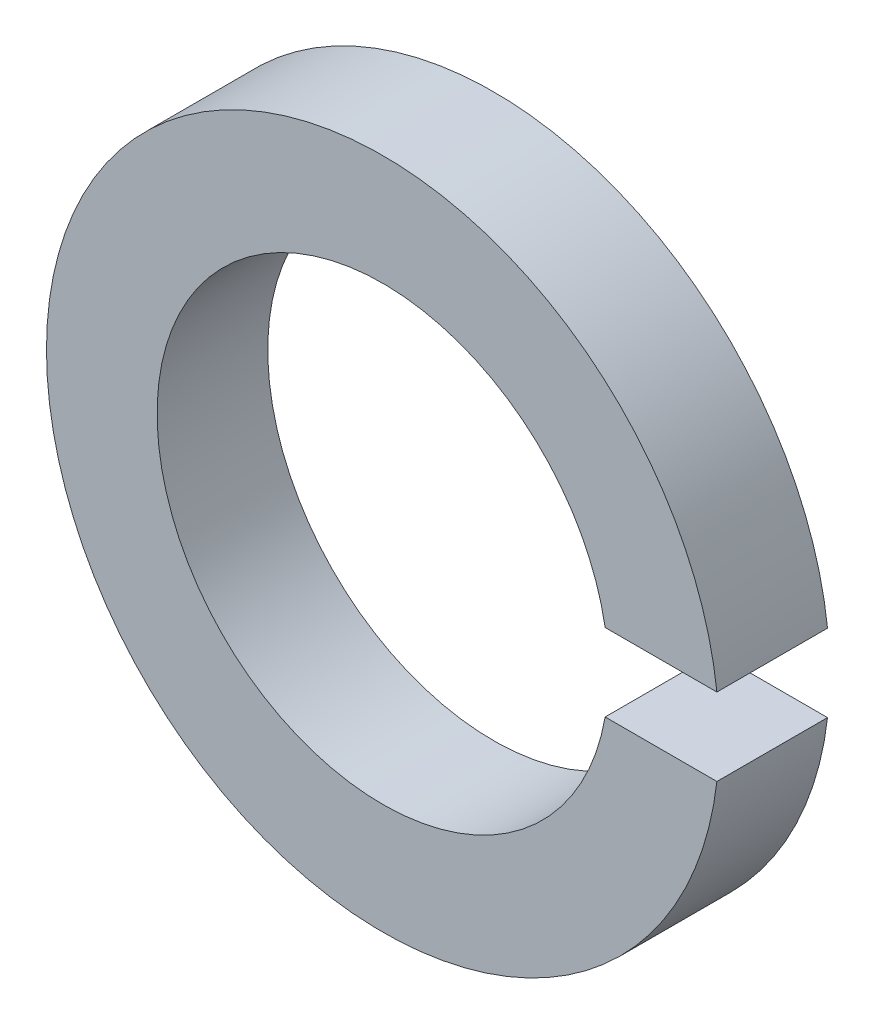
ISO-10303-21;
HEADER;
FILE_DESCRIPTION(('STEP AP214'),'2;1');
FILE_NAME('part.step','',(''),(''),'','','');
FILE_SCHEMA(('AUTOMOTIVE_DESIGN { 1 0 10303 214 1 1 1 1 }'));
ENDSEC;
DATA;
#1=APPLICATION_CONTEXT('core data for automotive mechanical design processes');
#2=APPLICATION_PROTOCOL_DEFINITION('international standard','automotive_design',2000,#1);
#3=PRODUCT_CONTEXT('',#1,'mechanical');
#4=PRODUCT('Part','Part','',(#3));
#5=PRODUCT_RELATED_PRODUCT_CATEGORY('part','',(#4));
#6=PRODUCT_DEFINITION_FORMATION('','',#4);
#7=PRODUCT_DEFINITION_CONTEXT('part definition',#1,'design');
#8=PRODUCT_DEFINITION('design','',#6,#7);
#9=PRODUCT_DEFINITION_SHAPE('','',#8);
#10=(LENGTH_UNIT() NAMED_UNIT(*) SI_UNIT(.MILLI.,.METRE.));
#11=(NAMED_UNIT(*) PLANE_ANGLE_UNIT() SI_UNIT($,.RADIAN.));
#12=(NAMED_UNIT(*) SI_UNIT($,.STERADIAN.) SOLID_ANGLE_UNIT());
#13=UNCERTAINTY_MEASURE_WITH_UNIT(LENGTH_MEASURE(1.E-05),#10,'distance_accuracy_value','');
#14=(GEOMETRIC_REPRESENTATION_CONTEXT(3) GLOBAL_UNCERTAINTY_ASSIGNED_CONTEXT((#13)) GLOBAL_UNIT_ASSIGNED_CONTEXT((#10,
#11,#12)) REPRESENTATION_CONTEXT('',''));
#15=CARTESIAN_POINT('',(0.,0.,0.));
#16=DIRECTION('',(0.,0.,1.));
#17=DIRECTION('',(1.,0.,0.));
#18=AXIS2_PLACEMENT_3D('',#15,#16,#17);
#19=CARTESIAN_POINT('',(0.,0.,2.5));
#20=DIRECTION('',(0.,0.,1.));
#21=DIRECTION('',(1.,0.,0.));
#22=AXIS2_PLACEMENT_3D('',#19,#20,#21);
#23=PLANE('',#22);
#24=DIRECTION('',(-1.,0.,0.));
#25=VECTOR('',#24,1.);
#26=CARTESIAN_POINT('',(4.93106962871061,0.875,2.5));
#27=LINE('',#26,#25);
#28=CARTESIAN_POINT('',(7.54946190135429,0.875,2.5));
#29=VERTEX_POINT('',#28);
#30=CARTESIAN_POINT('',(5.0243780709656,0.875,2.5));
#31=VERTEX_POINT('',#30);
#32=EDGE_CURVE('E51',#29,#31,#27,.T.);
#33=ORIENTED_EDGE('',*,*,#32,.F.);
#34=CARTESIAN_POINT('',(0.,0.,2.5));
#35=DIRECTION('',(0.,0.,1.));
#36=DIRECTION('',(1.,0.,0.));
#37=AXIS2_PLACEMENT_3D('',#34,#35,#36);
#38=CIRCLE('',#37,7.6);
#39=CARTESIAN_POINT('',(7.54946190135429,-0.875,2.5));
#40=VERTEX_POINT('',#39);
#41=EDGE_CURVE('E74',#29,#40,#38,.T.);
#42=ORIENTED_EDGE('',*,*,#41,.T.);
#43=DIRECTION('',(1.,0.,0.));
#44=VECTOR('',#43,1.);
#45=CARTESIAN_POINT('',(4.93106962871061,-0.875,2.5));
#46=LINE('',#45,#44);
#47=CARTESIAN_POINT('',(5.0243780709656,-0.875,2.5));
#48=VERTEX_POINT('',#47);
#49=EDGE_CURVE('E68',#48,#40,#46,.T.);
#50=ORIENTED_EDGE('',*,*,#49,.F.);
#51=CARTESIAN_POINT('',(0.,0.,2.5));
#52=DIRECTION('',(0.,0.,1.));
#53=DIRECTION('',(1.,0.,0.));
#54=AXIS2_PLACEMENT_3D('',#51,#52,#53);
#55=CIRCLE('',#54,5.1);
#56=EDGE_CURVE('E78',#31,#48,#55,.T.);
#57=ORIENTED_EDGE('',*,*,#56,.F.);
#58=EDGE_LOOP('',(#33,#42,#50,#57));
#59=FACE_BOUND('',#58,.T.);
#60=ADVANCED_FACE('F29',(#59),#23,.T.);
#61=CARTESIAN_POINT('',(0.,0.,0.));
#62=DIRECTION('',(0.,0.,1.));
#63=DIRECTION('',(1.,0.,0.));
#64=AXIS2_PLACEMENT_3D('',#61,#62,#63);
#65=PLANE('',#64);
#66=CARTESIAN_POINT('',(0.,0.,0.));
#67=DIRECTION('',(0.,0.,1.));
#68=DIRECTION('',(1.,0.,0.));
#69=AXIS2_PLACEMENT_3D('',#66,#67,#68);
#70=CIRCLE('',#69,7.6);
#71=CARTESIAN_POINT('',(7.54946190135429,0.875,0.));
#72=VERTEX_POINT('',#71);
#73=CARTESIAN_POINT('',(7.54946190135429,-0.875,0.));
#74=VERTEX_POINT('',#73);
#75=EDGE_CURVE('E82',#72,#74,#70,.T.);
#76=ORIENTED_EDGE('',*,*,#75,.F.);
#77=DIRECTION('',(-1.,0.,0.));
#78=VECTOR('',#77,1.);
#79=CARTESIAN_POINT('',(4.93106962871061,0.875,0.));
#80=LINE('',#79,#78);
#81=CARTESIAN_POINT('',(5.0243780709656,0.875,0.));
#82=VERTEX_POINT('',#81);
#83=EDGE_CURVE('E95',#72,#82,#80,.T.);
#84=ORIENTED_EDGE('',*,*,#83,.T.);
#85=CARTESIAN_POINT('',(0.,0.,0.));
#86=DIRECTION('',(0.,0.,1.));
#87=DIRECTION('',(1.,0.,0.));
#88=AXIS2_PLACEMENT_3D('',#85,#86,#87);
#89=CIRCLE('',#88,5.1);
#90=CARTESIAN_POINT('',(5.0243780709656,-0.875,0.));
#91=VERTEX_POINT('',#90);
#92=EDGE_CURVE('E83',#82,#91,#89,.T.);
#93=ORIENTED_EDGE('',*,*,#92,.T.);
#94=DIRECTION('',(1.,0.,0.));
#95=VECTOR('',#94,1.);
#96=CARTESIAN_POINT('',(4.93106962871061,-0.875,0.));
#97=LINE('',#96,#95);
#98=EDGE_CURVE('E44',#91,#74,#97,.T.);
#99=ORIENTED_EDGE('',*,*,#98,.T.);
#100=EDGE_LOOP('',(#76,#84,#93,#99));
#101=FACE_BOUND('',#100,.T.);
#102=ADVANCED_FACE('F101',(#101),#65,.F.);
#103=CARTESIAN_POINT('',(0.,0.,2.5));
#104=DIRECTION('',(0.,0.,-1.));
#105=DIRECTION('',(-1.,0.,0.));
#106=AXIS2_PLACEMENT_3D('',#103,#104,#105);
#107=CYLINDRICAL_SURFACE('',#106,7.6);
#108=ORIENTED_EDGE('',*,*,#41,.F.);
#109=DIRECTION('',(0.,0.,-1.));
#110=VECTOR('',#109,1.);
#111=CARTESIAN_POINT('',(7.54946190135429,0.875,2.5));
#112=LINE('',#111,#110);
#113=EDGE_CURVE('E87',#29,#72,#112,.T.);
#114=ORIENTED_EDGE('',*,*,#113,.T.);
#115=ORIENTED_EDGE('',*,*,#75,.T.);
#116=DIRECTION('',(0.,0.,-1.));
#117=VECTOR('',#116,1.);
#118=CARTESIAN_POINT('',(7.54946190135429,-0.875,2.5));
#119=LINE('',#118,#117);
#120=EDGE_CURVE('E93',#74,#40,#119,.F.);
#121=ORIENTED_EDGE('',*,*,#120,.T.);
#122=EDGE_LOOP('',(#108,#114,#115,#121));
#123=FACE_BOUND('',#122,.T.);
#124=ADVANCED_FACE('F31',(#123),#107,.T.);
#125=CARTESIAN_POINT('',(0.,0.,2.5));
#126=DIRECTION('',(0.,0.,-1.));
#127=DIRECTION('',(-1.,0.,0.));
#128=AXIS2_PLACEMENT_3D('',#125,#126,#127);
#129=CYLINDRICAL_SURFACE('',#128,5.1);
#130=DIRECTION('',(0.,0.,-1.));
#131=VECTOR('',#130,1.);
#132=CARTESIAN_POINT('',(5.0243780709656,0.875,2.5));
#133=LINE('',#132,#131);
#134=EDGE_CURVE('E11',#31,#82,#133,.T.);
#135=ORIENTED_EDGE('',*,*,#134,.F.);
#136=ORIENTED_EDGE('',*,*,#56,.T.);
#137=DIRECTION('',(0.,0.,-1.));
#138=VECTOR('',#137,1.);
#139=CARTESIAN_POINT('',(5.0243780709656,-0.875,2.5));
#140=LINE('',#139,#138);
#141=EDGE_CURVE('E37',#91,#48,#140,.F.);
#142=ORIENTED_EDGE('',*,*,#141,.F.);
#143=ORIENTED_EDGE('',*,*,#92,.F.);
#144=EDGE_LOOP('',(#135,#136,#142,#143));
#145=FACE_BOUND('',#144,.T.);
#146=ADVANCED_FACE('F81',(#145),#129,.F.);
#147=CARTESIAN_POINT('',(4.93106962871061,-0.875,0.));
#148=DIRECTION('',(0.,-1.,0.));
#149=DIRECTION('',(0.,0.,-1.));
#150=AXIS2_PLACEMENT_3D('',#147,#148,#149);
#151=PLANE('',#150);
#152=ORIENTED_EDGE('',*,*,#98,.F.);
#153=ORIENTED_EDGE('',*,*,#141,.T.);
#154=ORIENTED_EDGE('',*,*,#49,.T.);
#155=ORIENTED_EDGE('',*,*,#120,.F.);
#156=EDGE_LOOP('',(#152,#153,#154,#155));
#157=FACE_BOUND('',#156,.T.);
#158=ADVANCED_FACE('F67',(#157),#151,.F.);
#159=CARTESIAN_POINT('',(4.93106962871061,0.875,0.));
#160=DIRECTION('',(0.,1.,0.));
#161=DIRECTION('',(0.,0.,1.));
#162=AXIS2_PLACEMENT_3D('',#159,#160,#161);
#163=PLANE('',#162);
#164=ORIENTED_EDGE('',*,*,#32,.T.);
#165=ORIENTED_EDGE('',*,*,#134,.T.);
#166=ORIENTED_EDGE('',*,*,#83,.F.);
#167=ORIENTED_EDGE('',*,*,#113,.F.);
#168=EDGE_LOOP('',(#164,#165,#166,#167));
#169=FACE_BOUND('',#168,.T.);
#170=ADVANCED_FACE('F103',(#169),#163,.F.);
#171=CLOSED_SHELL('',(#60,#102,#124,#146,#158,#170));
#172=MANIFOLD_SOLID_BREP('B2',#171);
#173=ADVANCED_BREP_SHAPE_REPRESENTATION('',(#18,#172),#14);
#174=SHAPE_DEFINITION_REPRESENTATION(#9,#173);
ENDSEC;
END-ISO-10303-21;
